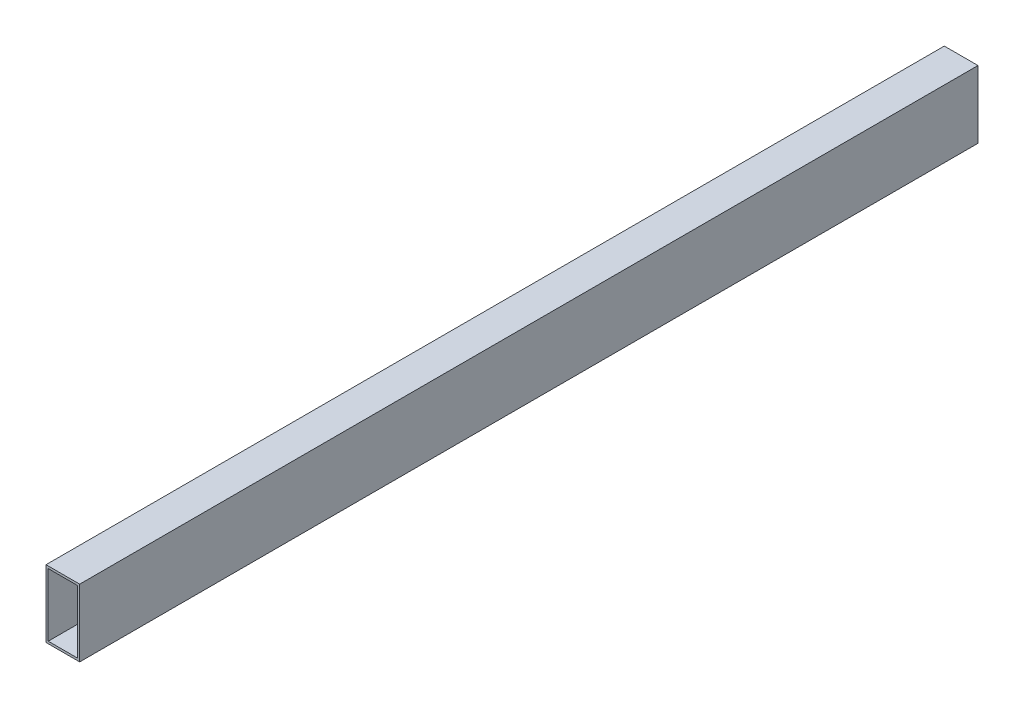
ISO-10303-21;
HEADER;
FILE_DESCRIPTION(('STEP AP214'),'2;1');
FILE_NAME('part.step','',(''),(''),'','','');
FILE_SCHEMA(('AUTOMOTIVE_DESIGN { 1 0 10303 214 1 1 1 1 }'));
ENDSEC;
DATA;
#1=APPLICATION_CONTEXT('core data for automotive mechanical design processes');
#2=APPLICATION_PROTOCOL_DEFINITION('international standard','automotive_design',2000,#1);
#3=PRODUCT_CONTEXT('',#1,'mechanical');
#4=PRODUCT('Part','Part','',(#3));
#5=PRODUCT_RELATED_PRODUCT_CATEGORY('part','',(#4));
#6=PRODUCT_DEFINITION_FORMATION('','',#4);
#7=PRODUCT_DEFINITION_CONTEXT('part definition',#1,'design');
#8=PRODUCT_DEFINITION('design','',#6,#7);
#9=PRODUCT_DEFINITION_SHAPE('','',#8);
#10=(LENGTH_UNIT() NAMED_UNIT(*) SI_UNIT(.MILLI.,.METRE.));
#11=(NAMED_UNIT(*) PLANE_ANGLE_UNIT() SI_UNIT($,.RADIAN.));
#12=(NAMED_UNIT(*) SI_UNIT($,.STERADIAN.) SOLID_ANGLE_UNIT());
#13=UNCERTAINTY_MEASURE_WITH_UNIT(LENGTH_MEASURE(1.E-05),#10,'distance_accuracy_value','');
#14=(GEOMETRIC_REPRESENTATION_CONTEXT(3) GLOBAL_UNCERTAINTY_ASSIGNED_CONTEXT((#13)) GLOBAL_UNIT_ASSIGNED_CONTEXT((#10,
#11,#12)) REPRESENTATION_CONTEXT('',''));
#15=CARTESIAN_POINT('',(0.,0.,0.));
#16=DIRECTION('',(0.,0.,1.));
#17=DIRECTION('',(1.,0.,0.));
#18=AXIS2_PLACEMENT_3D('',#15,#16,#17);
#19=CARTESIAN_POINT('',(0.,0.,800.));
#20=DIRECTION('',(0.,0.,1.));
#21=DIRECTION('',(1.,0.,0.));
#22=AXIS2_PLACEMENT_3D('',#19,#20,#21);
#23=PLANE('',#22);
#24=DIRECTION('',(0.,-1.,0.));
#25=VECTOR('',#24,1.);
#26=CARTESIAN_POINT('',(-48.5553210788599,33.7895307793217,800.));
#27=LINE('',#26,#25);
#28=CARTESIAN_POINT('',(-48.5553210788599,33.7895307793217,800.));
#29=VERTEX_POINT('',#28);
#30=CARTESIAN_POINT('',(-48.5553210788599,-26.2104692206783,800.));
#31=VERTEX_POINT('',#30);
#32=EDGE_CURVE('E134',#29,#31,#27,.T.);
#33=ORIENTED_EDGE('',*,*,#32,.T.);
#34=DIRECTION('',(1.,0.,0.));
#35=VECTOR('',#34,1.);
#36=CARTESIAN_POINT('',(-48.5553210788599,-26.2104692206783,800.));
#37=LINE('',#36,#35);
#38=CARTESIAN_POINT('',(-18.5553210788599,-26.2104692206783,800.));
#39=VERTEX_POINT('',#38);
#40=EDGE_CURVE('E137',#31,#39,#37,.T.);
#41=ORIENTED_EDGE('',*,*,#40,.T.);
#42=DIRECTION('',(0.,1.,0.));
#43=VECTOR('',#42,1.);
#44=CARTESIAN_POINT('',(-18.5553210788599,33.7895307793217,800.));
#45=LINE('',#44,#43);
#46=CARTESIAN_POINT('',(-18.5553210788599,33.7895307793217,800.));
#47=VERTEX_POINT('',#46);
#48=EDGE_CURVE('E140',#39,#47,#45,.T.);
#49=ORIENTED_EDGE('',*,*,#48,.T.);
#50=DIRECTION('',(-1.,0.,0.));
#51=VECTOR('',#50,1.);
#52=CARTESIAN_POINT('',(-48.5553210788599,33.7895307793217,800.));
#53=LINE('',#52,#51);
#54=EDGE_CURVE('E142',#47,#29,#53,.T.);
#55=ORIENTED_EDGE('',*,*,#54,.T.);
#56=EDGE_LOOP('',(#33,#41,#49,#55));
#57=FACE_BOUND('',#56,.T.);
#58=DIRECTION('',(1.,0.,0.));
#59=VECTOR('',#58,1.);
#60=CARTESIAN_POINT('',(-46.5553210788599,-24.2104692206783,800.));
#61=LINE('',#60,#59);
#62=CARTESIAN_POINT('',(-46.5553210788599,-24.2104692206783,800.));
#63=VERTEX_POINT('',#62);
#64=CARTESIAN_POINT('',(-20.5553210788599,-24.2104692206783,800.));
#65=VERTEX_POINT('',#64);
#66=EDGE_CURVE('E106',#63,#65,#61,.T.);
#67=ORIENTED_EDGE('',*,*,#66,.F.);
#68=DIRECTION('',(0.,-1.,0.));
#69=VECTOR('',#68,1.);
#70=CARTESIAN_POINT('',(-46.5553210788599,31.7895307793217,800.));
#71=LINE('',#70,#69);
#72=CARTESIAN_POINT('',(-46.5553210788599,31.7895307793217,800.));
#73=VERTEX_POINT('',#72);
#74=EDGE_CURVE('E98',#73,#63,#71,.T.);
#75=ORIENTED_EDGE('',*,*,#74,.F.);
#76=DIRECTION('',(-1.,0.,0.));
#77=VECTOR('',#76,1.);
#78=CARTESIAN_POINT('',(-46.5553210788599,31.7895307793217,800.));
#79=LINE('',#78,#77);
#80=CARTESIAN_POINT('',(-20.5553210788599,31.7895307793217,800.));
#81=VERTEX_POINT('',#80);
#82=EDGE_CURVE('E120',#81,#73,#79,.T.);
#83=ORIENTED_EDGE('',*,*,#82,.F.);
#84=DIRECTION('',(0.,1.,0.));
#85=VECTOR('',#84,1.);
#86=CARTESIAN_POINT('',(-20.5553210788599,31.7895307793217,800.));
#87=LINE('',#86,#85);
#88=EDGE_CURVE('E118',#65,#81,#87,.T.);
#89=ORIENTED_EDGE('',*,*,#88,.F.);
#90=EDGE_LOOP('',(#67,#75,#83,#89));
#91=FACE_BOUND('',#90,.T.);
#92=ADVANCED_FACE('F33',(#57,#91),#23,.T.);
#93=CARTESIAN_POINT('',(0.,0.,0.));
#94=DIRECTION('',(0.,0.,1.));
#95=DIRECTION('',(1.,0.,0.));
#96=AXIS2_PLACEMENT_3D('',#93,#94,#95);
#97=PLANE('',#96);
#98=DIRECTION('',(0.,-1.,0.));
#99=VECTOR('',#98,1.);
#100=CARTESIAN_POINT('',(-48.5553210788599,33.7895307793217,0.));
#101=LINE('',#100,#99);
#102=CARTESIAN_POINT('',(-48.5553210788599,33.7895307793217,0.));
#103=VERTEX_POINT('',#102);
#104=CARTESIAN_POINT('',(-48.5553210788599,-26.2104692206783,0.));
#105=VERTEX_POINT('',#104);
#106=EDGE_CURVE('E114',#103,#105,#101,.T.);
#107=ORIENTED_EDGE('',*,*,#106,.F.);
#108=DIRECTION('',(-1.,0.,0.));
#109=VECTOR('',#108,1.);
#110=CARTESIAN_POINT('',(-48.5553210788599,33.7895307793217,0.));
#111=LINE('',#110,#109);
#112=CARTESIAN_POINT('',(-18.5553210788599,33.7895307793217,0.));
#113=VERTEX_POINT('',#112);
#114=EDGE_CURVE('E138',#113,#103,#111,.T.);
#115=ORIENTED_EDGE('',*,*,#114,.F.);
#116=DIRECTION('',(0.,1.,0.));
#117=VECTOR('',#116,1.);
#118=CARTESIAN_POINT('',(-18.5553210788599,33.7895307793217,0.));
#119=LINE('',#118,#117);
#120=CARTESIAN_POINT('',(-18.5553210788599,-26.2104692206783,0.));
#121=VERTEX_POINT('',#120);
#122=EDGE_CURVE('E149',#121,#113,#119,.T.);
#123=ORIENTED_EDGE('',*,*,#122,.F.);
#124=DIRECTION('',(1.,0.,0.));
#125=VECTOR('',#124,1.);
#126=CARTESIAN_POINT('',(-48.5553210788599,-26.2104692206783,0.));
#127=LINE('',#126,#125);
#128=EDGE_CURVE('E147',#105,#121,#127,.T.);
#129=ORIENTED_EDGE('',*,*,#128,.F.);
#130=EDGE_LOOP('',(#107,#115,#123,#129));
#131=FACE_BOUND('',#130,.T.);
#132=DIRECTION('',(0.,-1.,0.));
#133=VECTOR('',#132,1.);
#134=CARTESIAN_POINT('',(-46.5553210788599,31.7895307793217,0.));
#135=LINE('',#134,#133);
#136=CARTESIAN_POINT('',(-46.5553210788599,31.7895307793217,0.));
#137=VERTEX_POINT('',#136);
#138=CARTESIAN_POINT('',(-46.5553210788599,-24.2104692206783,0.));
#139=VERTEX_POINT('',#138);
#140=EDGE_CURVE('E56',#137,#139,#135,.T.);
#141=ORIENTED_EDGE('',*,*,#140,.T.);
#142=DIRECTION('',(1.,0.,0.));
#143=VECTOR('',#142,1.);
#144=CARTESIAN_POINT('',(-46.5553210788599,-24.2104692206783,0.));
#145=LINE('',#144,#143);
#146=CARTESIAN_POINT('',(-20.5553210788599,-24.2104692206783,0.));
#147=VERTEX_POINT('',#146);
#148=EDGE_CURVE('E113',#139,#147,#145,.T.);
#149=ORIENTED_EDGE('',*,*,#148,.T.);
#150=DIRECTION('',(0.,1.,0.));
#151=VECTOR('',#150,1.);
#152=CARTESIAN_POINT('',(-20.5553210788599,31.7895307793217,0.));
#153=LINE('',#152,#151);
#154=CARTESIAN_POINT('',(-20.5553210788599,31.7895307793217,0.));
#155=VERTEX_POINT('',#154);
#156=EDGE_CURVE('E126',#147,#155,#153,.T.);
#157=ORIENTED_EDGE('',*,*,#156,.T.);
#158=DIRECTION('',(-1.,0.,0.));
#159=VECTOR('',#158,1.);
#160=CARTESIAN_POINT('',(-46.5553210788599,31.7895307793217,0.));
#161=LINE('',#160,#159);
#162=EDGE_CURVE('E107',#155,#137,#161,.T.);
#163=ORIENTED_EDGE('',*,*,#162,.T.);
#164=EDGE_LOOP('',(#141,#149,#157,#163));
#165=FACE_BOUND('',#164,.T.);
#166=ADVANCED_FACE('F167',(#131,#165),#97,.F.);
#167=CARTESIAN_POINT('',(-48.5553210788599,33.7895307793217,800.));
#168=DIRECTION('',(1.,0.,0.));
#169=DIRECTION('',(0.,1.,0.));
#170=AXIS2_PLACEMENT_3D('',#167,#168,#169);
#171=PLANE('',#170);
#172=ORIENTED_EDGE('',*,*,#106,.T.);
#173=DIRECTION('',(0.,0.,-1.));
#174=VECTOR('',#173,1.);
#175=CARTESIAN_POINT('',(-48.5553210788599,-26.2104692206783,800.));
#176=LINE('',#175,#174);
#177=EDGE_CURVE('E11',#31,#105,#176,.T.);
#178=ORIENTED_EDGE('',*,*,#177,.F.);
#179=ORIENTED_EDGE('',*,*,#32,.F.);
#180=DIRECTION('',(0.,0.,-1.));
#181=VECTOR('',#180,1.);
#182=CARTESIAN_POINT('',(-48.5553210788599,33.7895307793217,800.));
#183=LINE('',#182,#181);
#184=EDGE_CURVE('E144',#29,#103,#183,.T.);
#185=ORIENTED_EDGE('',*,*,#184,.T.);
#186=EDGE_LOOP('',(#172,#178,#179,#185));
#187=FACE_BOUND('',#186,.T.);
#188=ADVANCED_FACE('F35',(#187),#171,.F.);
#189=CARTESIAN_POINT('',(-48.5553210788599,-26.2104692206783,800.));
#190=DIRECTION('',(0.,1.,0.));
#191=DIRECTION('',(0.,0.,1.));
#192=AXIS2_PLACEMENT_3D('',#189,#190,#191);
#193=PLANE('',#192);
#194=ORIENTED_EDGE('',*,*,#128,.T.);
#195=DIRECTION('',(0.,0.,-1.));
#196=VECTOR('',#195,1.);
#197=CARTESIAN_POINT('',(-18.5553210788599,-26.2104692206783,800.));
#198=LINE('',#197,#196);
#199=EDGE_CURVE('E41',#39,#121,#198,.T.);
#200=ORIENTED_EDGE('',*,*,#199,.F.);
#201=ORIENTED_EDGE('',*,*,#40,.F.);
#202=ORIENTED_EDGE('',*,*,#177,.T.);
#203=EDGE_LOOP('',(#194,#200,#201,#202));
#204=FACE_BOUND('',#203,.T.);
#205=ADVANCED_FACE('F177',(#204),#193,.F.);
#206=CARTESIAN_POINT('',(-18.5553210788599,33.7895307793217,800.));
#207=DIRECTION('',(-1.,0.,0.));
#208=DIRECTION('',(0.,-1.,0.));
#209=AXIS2_PLACEMENT_3D('',#206,#207,#208);
#210=PLANE('',#209);
#211=ORIENTED_EDGE('',*,*,#122,.T.);
#212=DIRECTION('',(0.,0.,-1.));
#213=VECTOR('',#212,1.);
#214=CARTESIAN_POINT('',(-18.5553210788599,33.7895307793217,800.));
#215=LINE('',#214,#213);
#216=EDGE_CURVE('E154',#47,#113,#215,.T.);
#217=ORIENTED_EDGE('',*,*,#216,.F.);
#218=ORIENTED_EDGE('',*,*,#48,.F.);
#219=ORIENTED_EDGE('',*,*,#199,.T.);
#220=EDGE_LOOP('',(#211,#217,#218,#219));
#221=FACE_BOUND('',#220,.T.);
#222=ADVANCED_FACE('F161',(#221),#210,.F.);
#223=CARTESIAN_POINT('',(-48.5553210788599,33.7895307793217,800.));
#224=DIRECTION('',(0.,-1.,0.));
#225=DIRECTION('',(0.,0.,-1.));
#226=AXIS2_PLACEMENT_3D('',#223,#224,#225);
#227=PLANE('',#226);
#228=ORIENTED_EDGE('',*,*,#114,.T.);
#229=ORIENTED_EDGE('',*,*,#184,.F.);
#230=ORIENTED_EDGE('',*,*,#54,.F.);
#231=ORIENTED_EDGE('',*,*,#216,.T.);
#232=EDGE_LOOP('',(#228,#229,#230,#231));
#233=FACE_BOUND('',#232,.T.);
#234=ADVANCED_FACE('F171',(#233),#227,.F.);
#235=CARTESIAN_POINT('',(-46.5553210788599,31.7895307793217,800.));
#236=DIRECTION('',(1.,0.,0.));
#237=DIRECTION('',(0.,1.,0.));
#238=AXIS2_PLACEMENT_3D('',#235,#236,#237);
#239=PLANE('',#238);
#240=ORIENTED_EDGE('',*,*,#140,.F.);
#241=DIRECTION('',(0.,0.,-1.));
#242=VECTOR('',#241,1.);
#243=CARTESIAN_POINT('',(-46.5553210788599,31.7895307793217,800.));
#244=LINE('',#243,#242);
#245=EDGE_CURVE('E102',#73,#137,#244,.T.);
#246=ORIENTED_EDGE('',*,*,#245,.F.);
#247=ORIENTED_EDGE('',*,*,#74,.T.);
#248=DIRECTION('',(0.,0.,-1.));
#249=VECTOR('',#248,1.);
#250=CARTESIAN_POINT('',(-46.5553210788599,-24.2104692206783,800.));
#251=LINE('',#250,#249);
#252=EDGE_CURVE('E101',#63,#139,#251,.T.);
#253=ORIENTED_EDGE('',*,*,#252,.T.);
#254=EDGE_LOOP('',(#240,#246,#247,#253));
#255=FACE_BOUND('',#254,.T.);
#256=ADVANCED_FACE('F100',(#255),#239,.T.);
#257=CARTESIAN_POINT('',(-46.5553210788599,-24.2104692206783,800.));
#258=DIRECTION('',(0.,1.,0.));
#259=DIRECTION('',(0.,0.,1.));
#260=AXIS2_PLACEMENT_3D('',#257,#258,#259);
#261=PLANE('',#260);
#262=ORIENTED_EDGE('',*,*,#148,.F.);
#263=ORIENTED_EDGE('',*,*,#252,.F.);
#264=ORIENTED_EDGE('',*,*,#66,.T.);
#265=DIRECTION('',(0.,0.,-1.));
#266=VECTOR('',#265,1.);
#267=CARTESIAN_POINT('',(-20.5553210788599,-24.2104692206783,800.));
#268=LINE('',#267,#266);
#269=EDGE_CURVE('E115',#65,#147,#268,.T.);
#270=ORIENTED_EDGE('',*,*,#269,.T.);
#271=EDGE_LOOP('',(#262,#263,#264,#270));
#272=FACE_BOUND('',#271,.T.);
#273=ADVANCED_FACE('F110',(#272),#261,.T.);
#274=CARTESIAN_POINT('',(-20.5553210788599,31.7895307793217,800.));
#275=DIRECTION('',(-1.,0.,0.));
#276=DIRECTION('',(0.,-1.,0.));
#277=AXIS2_PLACEMENT_3D('',#274,#275,#276);
#278=PLANE('',#277);
#279=ORIENTED_EDGE('',*,*,#156,.F.);
#280=ORIENTED_EDGE('',*,*,#269,.F.);
#281=ORIENTED_EDGE('',*,*,#88,.T.);
#282=DIRECTION('',(0.,0.,-1.));
#283=VECTOR('',#282,1.);
#284=CARTESIAN_POINT('',(-20.5553210788599,31.7895307793217,800.));
#285=LINE('',#284,#283);
#286=EDGE_CURVE('E48',#81,#155,#285,.T.);
#287=ORIENTED_EDGE('',*,*,#286,.T.);
#288=EDGE_LOOP('',(#279,#280,#281,#287));
#289=FACE_BOUND('',#288,.T.);
#290=ADVANCED_FACE('F200',(#289),#278,.T.);
#291=CARTESIAN_POINT('',(-46.5553210788599,31.7895307793217,800.));
#292=DIRECTION('',(0.,-1.,0.));
#293=DIRECTION('',(0.,0.,-1.));
#294=AXIS2_PLACEMENT_3D('',#291,#292,#293);
#295=PLANE('',#294);
#296=ORIENTED_EDGE('',*,*,#162,.F.);
#297=ORIENTED_EDGE('',*,*,#286,.F.);
#298=ORIENTED_EDGE('',*,*,#82,.T.);
#299=ORIENTED_EDGE('',*,*,#245,.T.);
#300=EDGE_LOOP('',(#296,#297,#298,#299));
#301=FACE_BOUND('',#300,.T.);
#302=ADVANCED_FACE('F204',(#301),#295,.T.);
#303=CLOSED_SHELL('',(#92,#166,#188,#205,#222,#234,#256,#273,#290,#302));
#304=MANIFOLD_SOLID_BREP('B2',#303);
#305=ADVANCED_BREP_SHAPE_REPRESENTATION('',(#18,#304),#14);
#306=SHAPE_DEFINITION_REPRESENTATION(#9,#305);
ENDSEC;
END-ISO-10303-21;
